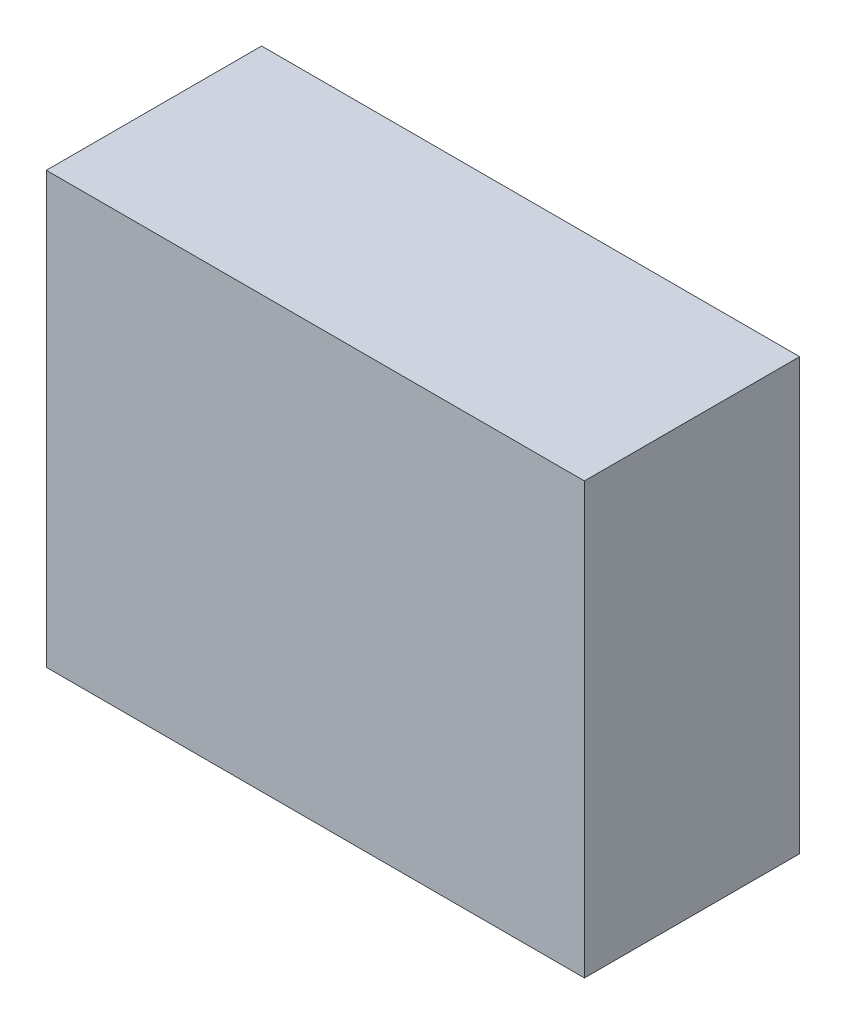
ISO-10303-21;
HEADER;
FILE_DESCRIPTION(('STEP AP214'),'2;1');
FILE_NAME('part.step','',(''),(''),'','','');
FILE_SCHEMA(('AUTOMOTIVE_DESIGN { 1 0 10303 214 1 1 1 1 }'));
ENDSEC;
DATA;
#1=APPLICATION_CONTEXT('core data for automotive mechanical design processes');
#2=APPLICATION_PROTOCOL_DEFINITION('international standard','automotive_design',2000,#1);
#3=PRODUCT_CONTEXT('',#1,'mechanical');
#4=PRODUCT('Part','Part','',(#3));
#5=PRODUCT_RELATED_PRODUCT_CATEGORY('part','',(#4));
#6=PRODUCT_DEFINITION_FORMATION('','',#4);
#7=PRODUCT_DEFINITION_CONTEXT('part definition',#1,'design');
#8=PRODUCT_DEFINITION('design','',#6,#7);
#9=PRODUCT_DEFINITION_SHAPE('','',#8);
#10=(LENGTH_UNIT() NAMED_UNIT(*) SI_UNIT(.MILLI.,.METRE.));
#11=(NAMED_UNIT(*) PLANE_ANGLE_UNIT() SI_UNIT($,.RADIAN.));
#12=(NAMED_UNIT(*) SI_UNIT($,.STERADIAN.) SOLID_ANGLE_UNIT());
#13=UNCERTAINTY_MEASURE_WITH_UNIT(LENGTH_MEASURE(1.E-05),#10,'distance_accuracy_value','');
#14=(GEOMETRIC_REPRESENTATION_CONTEXT(3) GLOBAL_UNCERTAINTY_ASSIGNED_CONTEXT((#13)) GLOBAL_UNIT_ASSIGNED_CONTEXT((#10,
#11,#12)) REPRESENTATION_CONTEXT('',''));
#15=CARTESIAN_POINT('',(0.,0.,0.));
#16=DIRECTION('',(0.,0.,1.));
#17=DIRECTION('',(1.,0.,0.));
#18=AXIS2_PLACEMENT_3D('',#15,#16,#17);
#19=CARTESIAN_POINT('',(25.,-20.,20.));
#20=DIRECTION('',(-1.,0.,0.));
#21=DIRECTION('',(0.,0.,1.));
#22=AXIS2_PLACEMENT_3D('',#19,#20,#21);
#23=PLANE('',#22);
#24=DIRECTION('',(0.,1.,0.));
#25=VECTOR('',#24,1.);
#26=CARTESIAN_POINT('',(25.,-20.,0.));
#27=LINE('',#26,#25);
#28=CARTESIAN_POINT('',(25.,-20.,0.));
#29=VERTEX_POINT('',#28);
#30=CARTESIAN_POINT('',(25.,20.,0.));
#31=VERTEX_POINT('',#30);
#32=EDGE_CURVE('E113',#29,#31,#27,.T.);
#33=ORIENTED_EDGE('',*,*,#32,.T.);
#34=DIRECTION('',(0.,0.,-1.));
#35=VECTOR('',#34,1.);
#36=CARTESIAN_POINT('',(25.,20.,20.));
#37=LINE('',#36,#35);
#38=CARTESIAN_POINT('',(25.,20.,20.));
#39=VERTEX_POINT('',#38);
#40=EDGE_CURVE('E11',#39,#31,#37,.T.);
#41=ORIENTED_EDGE('',*,*,#40,.F.);
#42=DIRECTION('',(0.,1.,0.));
#43=VECTOR('',#42,1.);
#44=CARTESIAN_POINT('',(25.,-20.,20.));
#45=LINE('',#44,#43);
#46=CARTESIAN_POINT('',(25.,-20.,20.));
#47=VERTEX_POINT('',#46);
#48=EDGE_CURVE('E97',#47,#39,#45,.T.);
#49=ORIENTED_EDGE('',*,*,#48,.F.);
#50=DIRECTION('',(0.,0.,-1.));
#51=VECTOR('',#50,1.);
#52=CARTESIAN_POINT('',(25.,-20.,20.));
#53=LINE('',#52,#51);
#54=EDGE_CURVE('E109',#47,#29,#53,.T.);
#55=ORIENTED_EDGE('',*,*,#54,.T.);
#56=EDGE_LOOP('',(#33,#41,#49,#55));
#57=FACE_BOUND('',#56,.T.);
#58=ADVANCED_FACE('F45',(#57),#23,.F.);
#59=CARTESIAN_POINT('',(-25.,20.,20.));
#60=DIRECTION('',(0.,-1.,0.));
#61=DIRECTION('',(0.,0.,-1.));
#62=AXIS2_PLACEMENT_3D('',#59,#60,#61);
#63=PLANE('',#62);
#64=DIRECTION('',(-1.,0.,0.));
#65=VECTOR('',#64,1.);
#66=CARTESIAN_POINT('',(-25.,20.,0.));
#67=LINE('',#66,#65);
#68=CARTESIAN_POINT('',(-25.,20.,0.));
#69=VERTEX_POINT('',#68);
#70=EDGE_CURVE('E102',#31,#69,#67,.T.);
#71=ORIENTED_EDGE('',*,*,#70,.T.);
#72=DIRECTION('',(0.,0.,-1.));
#73=VECTOR('',#72,1.);
#74=CARTESIAN_POINT('',(-25.,20.,20.));
#75=LINE('',#74,#73);
#76=CARTESIAN_POINT('',(-25.,20.,20.));
#77=VERTEX_POINT('',#76);
#78=EDGE_CURVE('E54',#77,#69,#75,.T.);
#79=ORIENTED_EDGE('',*,*,#78,.F.);
#80=DIRECTION('',(-1.,0.,0.));
#81=VECTOR('',#80,1.);
#82=CARTESIAN_POINT('',(-25.,20.,20.));
#83=LINE('',#82,#81);
#84=EDGE_CURVE('E92',#39,#77,#83,.T.);
#85=ORIENTED_EDGE('',*,*,#84,.F.);
#86=ORIENTED_EDGE('',*,*,#40,.T.);
#87=EDGE_LOOP('',(#71,#79,#85,#86));
#88=FACE_BOUND('',#87,.T.);
#89=ADVANCED_FACE('F101',(#88),#63,.F.);
#90=CARTESIAN_POINT('',(-25.,-20.,20.));
#91=DIRECTION('',(1.,0.,0.));
#92=DIRECTION('',(0.,0.,-1.));
#93=AXIS2_PLACEMENT_3D('',#90,#91,#92);
#94=PLANE('',#93);
#95=DIRECTION('',(0.,-1.,0.));
#96=VECTOR('',#95,1.);
#97=CARTESIAN_POINT('',(-25.,-20.,0.));
#98=LINE('',#97,#96);
#99=CARTESIAN_POINT('',(-25.,-20.,0.));
#100=VERTEX_POINT('',#99);
#101=EDGE_CURVE('E79',#69,#100,#98,.T.);
#102=ORIENTED_EDGE('',*,*,#101,.T.);
#103=DIRECTION('',(0.,0.,-1.));
#104=VECTOR('',#103,1.);
#105=CARTESIAN_POINT('',(-25.,-20.,20.));
#106=LINE('',#105,#104);
#107=CARTESIAN_POINT('',(-25.,-20.,20.));
#108=VERTEX_POINT('',#107);
#109=EDGE_CURVE('E104',#108,#100,#106,.T.);
#110=ORIENTED_EDGE('',*,*,#109,.F.);
#111=DIRECTION('',(0.,-1.,0.));
#112=VECTOR('',#111,1.);
#113=CARTESIAN_POINT('',(-25.,-20.,20.));
#114=LINE('',#113,#112);
#115=EDGE_CURVE('E95',#77,#108,#114,.T.);
#116=ORIENTED_EDGE('',*,*,#115,.F.);
#117=ORIENTED_EDGE('',*,*,#78,.T.);
#118=EDGE_LOOP('',(#102,#110,#116,#117));
#119=FACE_BOUND('',#118,.T.);
#120=ADVANCED_FACE('F105',(#119),#94,.F.);
#121=CARTESIAN_POINT('',(-25.,-20.,20.));
#122=DIRECTION('',(0.,1.,0.));
#123=DIRECTION('',(0.,0.,1.));
#124=AXIS2_PLACEMENT_3D('',#121,#122,#123);
#125=PLANE('',#124);
#126=DIRECTION('',(1.,0.,0.));
#127=VECTOR('',#126,1.);
#128=CARTESIAN_POINT('',(-25.,-20.,0.));
#129=LINE('',#128,#127);
#130=EDGE_CURVE('E85',#100,#29,#129,.T.);
#131=ORIENTED_EDGE('',*,*,#130,.T.);
#132=ORIENTED_EDGE('',*,*,#54,.F.);
#133=DIRECTION('',(1.,0.,0.));
#134=VECTOR('',#133,1.);
#135=CARTESIAN_POINT('',(-25.,-20.,20.));
#136=LINE('',#135,#134);
#137=EDGE_CURVE('E62',#108,#47,#136,.T.);
#138=ORIENTED_EDGE('',*,*,#137,.F.);
#139=ORIENTED_EDGE('',*,*,#109,.T.);
#140=EDGE_LOOP('',(#131,#132,#138,#139));
#141=FACE_BOUND('',#140,.T.);
#142=ADVANCED_FACE('F126',(#141),#125,.F.);
#143=CARTESIAN_POINT('',(0.,0.,20.));
#144=DIRECTION('',(0.,0.,-1.));
#145=DIRECTION('',(-1.,0.,0.));
#146=AXIS2_PLACEMENT_3D('',#143,#144,#145);
#147=PLANE('',#146);
#148=ORIENTED_EDGE('',*,*,#48,.T.);
#149=ORIENTED_EDGE('',*,*,#84,.T.);
#150=ORIENTED_EDGE('',*,*,#115,.T.);
#151=ORIENTED_EDGE('',*,*,#137,.T.);
#152=EDGE_LOOP('',(#148,#149,#150,#151));
#153=FACE_BOUND('',#152,.T.);
#154=ADVANCED_FACE('F93',(#153),#147,.F.);
#155=CARTESIAN_POINT('',(0.,0.,0.));
#156=DIRECTION('',(0.,0.,-1.));
#157=DIRECTION('',(-1.,0.,0.));
#158=AXIS2_PLACEMENT_3D('',#155,#156,#157);
#159=PLANE('',#158);
#160=ORIENTED_EDGE('',*,*,#32,.F.);
#161=ORIENTED_EDGE('',*,*,#130,.F.);
#162=ORIENTED_EDGE('',*,*,#101,.F.);
#163=ORIENTED_EDGE('',*,*,#70,.F.);
#164=EDGE_LOOP('',(#160,#161,#162,#163));
#165=FACE_BOUND('',#164,.T.);
#166=ADVANCED_FACE('F129',(#165),#159,.T.);
#167=CLOSED_SHELL('',(#58,#89,#120,#142,#154,#166));
#168=MANIFOLD_SOLID_BREP('B2',#167);
#169=ADVANCED_BREP_SHAPE_REPRESENTATION('',(#18,#168),#14);
#170=SHAPE_DEFINITION_REPRESENTATION(#9,#169);
ENDSEC;
END-ISO-10303-21;
